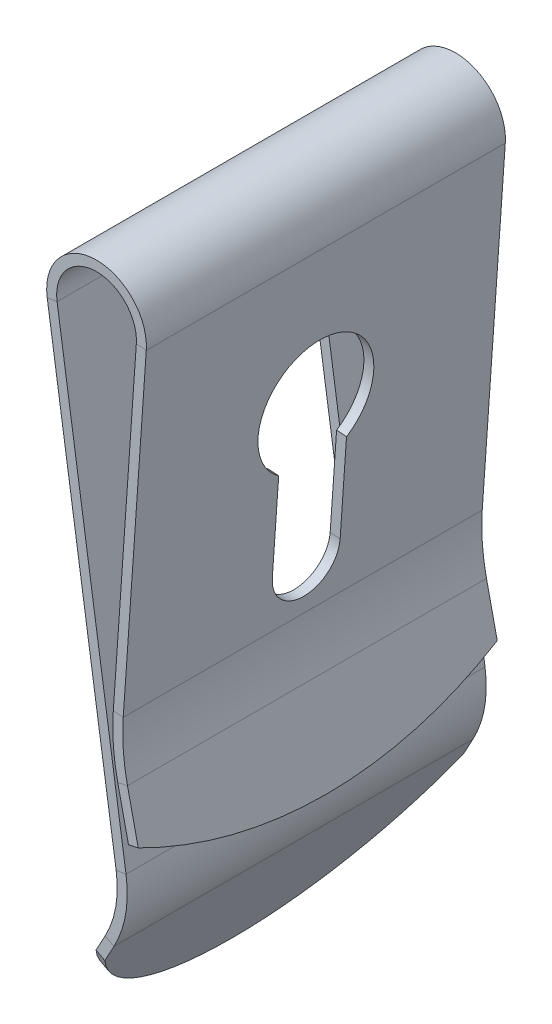
ISO-10303-21;
HEADER;
FILE_DESCRIPTION(('STEP AP214'),'2;1');
FILE_NAME('part.step','',(''),(''),'','','');
FILE_SCHEMA(('AUTOMOTIVE_DESIGN { 1 0 10303 214 1 1 1 1 }'));
ENDSEC;
DATA;
#1=APPLICATION_CONTEXT('core data for automotive mechanical design processes');
#2=APPLICATION_PROTOCOL_DEFINITION('international standard','automotive_design',2000,#1);
#3=PRODUCT_CONTEXT('',#1,'mechanical');
#4=PRODUCT('Part','Part','',(#3));
#5=PRODUCT_RELATED_PRODUCT_CATEGORY('part','',(#4));
#6=PRODUCT_DEFINITION_FORMATION('','',#4);
#7=PRODUCT_DEFINITION_CONTEXT('part definition',#1,'design');
#8=PRODUCT_DEFINITION('design','',#6,#7);
#9=PRODUCT_DEFINITION_SHAPE('','',#8);
#10=(LENGTH_UNIT() NAMED_UNIT(*) SI_UNIT(.MILLI.,.METRE.));
#11=(NAMED_UNIT(*) PLANE_ANGLE_UNIT() SI_UNIT($,.RADIAN.));
#12=(NAMED_UNIT(*) SI_UNIT($,.STERADIAN.) SOLID_ANGLE_UNIT());
#13=UNCERTAINTY_MEASURE_WITH_UNIT(LENGTH_MEASURE(1.E-05),#10,'distance_accuracy_value','');
#14=(GEOMETRIC_REPRESENTATION_CONTEXT(3) GLOBAL_UNCERTAINTY_ASSIGNED_CONTEXT((#13)) GLOBAL_UNIT_ASSIGNED_CONTEXT((#10,
#11,#12)) REPRESENTATION_CONTEXT('',''));
#15=CARTESIAN_POINT('',(0.,0.,0.));
#16=DIRECTION('',(0.,0.,1.));
#17=DIRECTION('',(1.,0.,0.));
#18=AXIS2_PLACEMENT_3D('',#15,#16,#17);
#19=CARTESIAN_POINT('',(-1.87719407398271,8.79440452735502,9.));
#20=DIRECTION('',(0.,0.,-1.));
#21=DIRECTION('',(0.147809411129617,-0.989015863361916,0.));
#22=AXIS2_PLACEMENT_3D('',#19,#20,#21);
#23=PLANE('',#22);
#24=DIRECTION('',(0.147809411129617,-0.989015863361916,0.));
#25=VECTOR('',#24,1.);
#26=CARTESIAN_POINT('',(-1.87719407398271,8.79440452735502,9.));
#27=LINE('',#26,#25);
#28=CARTESIAN_POINT('',(-3.21205123153018,17.7261423243411,9.));
#29=VERTEX_POINT('',#28);
#30=CARTESIAN_POINT('',(0.245047275760443,-5.40584391919345,9.));
#31=VERTEX_POINT('',#30);
#32=EDGE_CURVE('E333',#29,#31,#27,.T.);
#33=ORIENTED_EDGE('',*,*,#32,.T.);
#34=DIRECTION('',(0.989015863361916,0.147809411129617,0.));
#35=VECTOR('',#34,1.);
#36=CARTESIAN_POINT('',(0.245047275760442,-5.40584391919345,9.));
#37=LINE('',#36,#35);
#38=CARTESIAN_POINT('',(0.7395552074414,-5.33193921362864,9.));
#39=VERTEX_POINT('',#38);
#40=EDGE_CURVE('E299',#31,#39,#37,.T.);
#41=ORIENTED_EDGE('',*,*,#40,.T.);
#42=DIRECTION('',(0.147809411129617,-0.989015863361916,0.));
#43=VECTOR('',#42,1.);
#44=CARTESIAN_POINT('',(-1.38268614230175,8.86830923291983,9.));
#45=LINE('',#44,#43);
#46=CARTESIAN_POINT('',(-2.71754329984922,17.8000470299059,9.));
#47=VERTEX_POINT('',#46);
#48=EDGE_CURVE('E318',#47,#39,#45,.T.);
#49=ORIENTED_EDGE('',*,*,#48,.F.);
#50=DIRECTION('',(-0.989015863361916,-0.147809411129617,0.));
#51=VECTOR('',#50,1.);
#52=CARTESIAN_POINT('',(-3.21205123153018,17.7261423243411,9.));
#53=LINE('',#52,#51);
#54=EDGE_CURVE('E344',#47,#29,#53,.T.);
#55=ORIENTED_EDGE('',*,*,#54,.T.);
#56=EDGE_LOOP('',(#33,#41,#49,#55));
#57=FACE_BOUND('',#56,.T.);
#58=ADVANCED_FACE('F36',(#57),#23,.F.);
#59=CARTESIAN_POINT('',(-1.87719407398271,8.79440452735502,0.));
#60=DIRECTION('',(-0.989015863361916,-0.147809411129617,0.));
#61=DIRECTION('',(0.147809411129617,-0.989015863361916,0.));
#62=AXIS2_PLACEMENT_3D('',#59,#60,#61);
#63=PLANE('',#62);
#64=CARTESIAN_POINT('',(-2.16999488306638,10.7535804876395,0.));
#65=DIRECTION('',(-0.989015863361916,-0.147809411129617,0.));
#66=DIRECTION('',(-0.147809411129617,0.989015863361916,0.));
#67=AXIS2_PLACEMENT_3D('',#64,#65,#66);
#68=CIRCLE('',#67,3.55);
#69=CARTESIAN_POINT('',(-2.16999488306638,10.7535804876395,3.55));
#70=VERTEX_POINT('',#69);
#71=CARTESIAN_POINT('',(-2.16999488306638,10.7535804876395,-3.55));
#72=VERTEX_POINT('',#71);
#73=EDGE_CURVE('E245',#70,#72,#68,.T.);
#74=ORIENTED_EDGE('',*,*,#73,.F.);
#75=DIRECTION('',(-0.147809411129617,0.989015863361916,0.));
#76=VECTOR('',#75,1.);
#77=CARTESIAN_POINT('',(-2.16999488306638,10.7535804876395,3.55));
#78=LINE('',#77,#76);
#79=CARTESIAN_POINT('',(-1.16489088738498,4.02827261677847,3.55));
#80=VERTEX_POINT('',#79);
#81=EDGE_CURVE('E236',#80,#70,#78,.T.);
#82=ORIENTED_EDGE('',*,*,#81,.F.);
#83=CARTESIAN_POINT('',(-1.16489088738498,4.02827261677847,0.));
#84=DIRECTION('',(-0.989015863361916,-0.147809411129617,0.));
#85=DIRECTION('',(0.147809411129617,-0.989015863361916,0.));
#86=AXIS2_PLACEMENT_3D('',#83,#84,#85);
#87=CIRCLE('',#86,3.55);
#88=CARTESIAN_POINT('',(-1.16489088738498,4.02827261677847,-3.55));
#89=VERTEX_POINT('',#88);
#90=EDGE_CURVE('E239',#89,#80,#87,.T.);
#91=ORIENTED_EDGE('',*,*,#90,.F.);
#92=DIRECTION('',(0.147809411129617,-0.989015863361916,0.));
#93=VECTOR('',#92,1.);
#94=CARTESIAN_POINT('',(-2.16999488306638,10.7535804876395,-3.55));
#95=LINE('',#94,#93);
#96=EDGE_CURVE('E242',#72,#89,#95,.T.);
#97=ORIENTED_EDGE('',*,*,#96,.F.);
#98=EDGE_LOOP('',(#74,#82,#91,#97));
#99=FACE_BOUND('',#98,.T.);
#100=DIRECTION('',(-0.147809411129617,0.989015863361916,0.));
#101=VECTOR('',#100,1.);
#102=CARTESIAN_POINT('',(-1.87719407398271,8.79440452735502,-9.));
#103=LINE('',#102,#101);
#104=CARTESIAN_POINT('',(0.245047275760443,-5.40584391919345,-9.));
#105=VERTEX_POINT('',#104);
#106=CARTESIAN_POINT('',(-3.21205123153018,17.7261423243411,-9.));
#107=VERTEX_POINT('',#106);
#108=EDGE_CURVE('E327',#105,#107,#103,.T.);
#109=ORIENTED_EDGE('',*,*,#108,.F.);
#110=DIRECTION('',(0.,0.,1.));
#111=VECTOR('',#110,1.);
#112=CARTESIAN_POINT('',(0.245047275760442,-5.40584391919345,9.));
#113=LINE('',#112,#111);
#114=EDGE_CURVE('E305',#31,#105,#113,.F.);
#115=ORIENTED_EDGE('',*,*,#114,.F.);
#116=ORIENTED_EDGE('',*,*,#32,.F.);
#117=DIRECTION('',(0.,0.,1.));
#118=VECTOR('',#117,1.);
#119=CARTESIAN_POINT('',(-3.21205123153018,17.7261423243411,0.));
#120=LINE('',#119,#118);
#121=EDGE_CURVE('E330',#107,#29,#120,.T.);
#122=ORIENTED_EDGE('',*,*,#121,.F.);
#123=EDGE_LOOP('',(#109,#115,#116,#122));
#124=FACE_BOUND('',#123,.T.);
#125=ADVANCED_FACE('F447',(#99,#124),#63,.T.);
#126=CARTESIAN_POINT('',(-1.38268614230175,8.86830923291983,0.));
#127=DIRECTION('',(-0.989015863361916,-0.147809411129617,0.));
#128=DIRECTION('',(0.147809411129617,-0.989015863361916,0.));
#129=AXIS2_PLACEMENT_3D('',#126,#127,#128);
#130=PLANE('',#129);
#131=DIRECTION('',(0.147809411129617,-0.989015863361916,0.));
#132=VECTOR('',#131,1.);
#133=CARTESIAN_POINT('',(-1.67548695138542,10.8274851932043,3.55));
#134=LINE('',#133,#132);
#135=CARTESIAN_POINT('',(-1.67548695138542,10.8274851932043,3.55));
#136=VERTEX_POINT('',#135);
#137=CARTESIAN_POINT('',(-0.670382955704027,4.10217732234328,3.55));
#138=VERTEX_POINT('',#137);
#139=EDGE_CURVE('E250',#136,#138,#134,.T.);
#140=ORIENTED_EDGE('',*,*,#139,.F.);
#141=CARTESIAN_POINT('',(-1.67548695138542,10.8274851932043,0.));
#142=DIRECTION('',(-0.989015863361916,-0.147809411129617,0.));
#143=DIRECTION('',(0.147809411129617,-0.989015863361916,0.));
#144=AXIS2_PLACEMENT_3D('',#141,#142,#143);
#145=CIRCLE('',#144,3.55);
#146=CARTESIAN_POINT('',(-1.67548695138542,10.8274851932043,-3.55));
#147=VERTEX_POINT('',#146);
#148=EDGE_CURVE('E235',#147,#136,#145,.F.);
#149=ORIENTED_EDGE('',*,*,#148,.F.);
#150=DIRECTION('',(-0.147809411129617,0.989015863361916,0.));
#151=VECTOR('',#150,1.);
#152=CARTESIAN_POINT('',(-1.67548695138542,10.8274851932043,-3.55));
#153=LINE('',#152,#151);
#154=CARTESIAN_POINT('',(-0.670382955704026,4.10217732234328,-3.55));
#155=VERTEX_POINT('',#154);
#156=EDGE_CURVE('E232',#155,#147,#153,.T.);
#157=ORIENTED_EDGE('',*,*,#156,.F.);
#158=CARTESIAN_POINT('',(-0.670382955704027,4.10217732234328,0.));
#159=DIRECTION('',(-0.989015863361916,-0.147809411129617,0.));
#160=DIRECTION('',(0.147809411129617,-0.989015863361916,0.));
#161=AXIS2_PLACEMENT_3D('',#158,#159,#160);
#162=CIRCLE('',#161,3.55);
#163=EDGE_CURVE('E253',#138,#155,#162,.F.);
#164=ORIENTED_EDGE('',*,*,#163,.F.);
#165=EDGE_LOOP('',(#140,#149,#157,#164));
#166=FACE_BOUND('',#165,.T.);
#167=DIRECTION('',(0.,0.,1.));
#168=VECTOR('',#167,1.);
#169=CARTESIAN_POINT('',(0.7395552074414,-5.33193921362864,9.));
#170=LINE('',#169,#168);
#171=CARTESIAN_POINT('',(0.7395552074414,-5.33193921362864,-9.));
#172=VERTEX_POINT('',#171);
#173=EDGE_CURVE('E293',#39,#172,#170,.F.);
#174=ORIENTED_EDGE('',*,*,#173,.T.);
#175=DIRECTION('',(0.147809411129617,-0.989015863361916,0.));
#176=VECTOR('',#175,1.);
#177=CARTESIAN_POINT('',(-1.38268614230175,8.86830923291983,-9.));
#178=LINE('',#177,#176);
#179=CARTESIAN_POINT('',(-2.71754329984922,17.8000470299059,-9.));
#180=VERTEX_POINT('',#179);
#181=EDGE_CURVE('E336',#172,#180,#178,.F.);
#182=ORIENTED_EDGE('',*,*,#181,.T.);
#183=DIRECTION('',(0.,0.,1.));
#184=VECTOR('',#183,1.);
#185=CARTESIAN_POINT('',(-2.71754329984922,17.8000470299059,0.));
#186=LINE('',#185,#184);
#187=EDGE_CURVE('E338',#180,#47,#186,.T.);
#188=ORIENTED_EDGE('',*,*,#187,.T.);
#189=ORIENTED_EDGE('',*,*,#48,.T.);
#190=EDGE_LOOP('',(#174,#182,#188,#189));
#191=FACE_BOUND('',#190,.T.);
#192=ADVANCED_FACE('F431',(#166,#191),#130,.F.);
#193=CARTESIAN_POINT('',(0.498782025129912,-0.0348782368720627,9.));
#194=DIRECTION('',(-0.997564050259824,0.0697564737441255,0.));
#195=DIRECTION('',(-0.0697564737441255,-0.997564050259824,0.));
#196=AXIS2_PLACEMENT_3D('',#193,#194,#195);
#197=PLANE('',#196);
#198=DIRECTION('',(-0.0697564737441255,-0.997564050259824,0.));
#199=VECTOR('',#198,1.);
#200=CARTESIAN_POINT('',(1.09523698434969,8.49482507209064,1.70000000000001));
#201=LINE('',#200,#199);
#202=CARTESIAN_POINT('',(1.09523698434969,8.49482507209064,1.70000000000001));
#203=VERTEX_POINT('',#202);
#204=CARTESIAN_POINT('',(0.773427301904901,3.89273220526932,1.70000000000001));
#205=VERTEX_POINT('',#204);
#206=EDGE_CURVE('E216',#203,#205,#201,.T.);
#207=ORIENTED_EDGE('',*,*,#206,.F.);
#208=CARTESIAN_POINT('',(1.25912758894088,10.83856991096,0.));
#209=DIRECTION('',(0.997564050259824,-0.0697564737441255,0.));
#210=DIRECTION('',(-0.0697564737441255,-0.997564050259824,0.));
#211=AXIS2_PLACEMENT_3D('',#208,#209,#210);
#212=CIRCLE('',#211,2.9);
#213=CARTESIAN_POINT('',(1.09523698434969,8.49482507209064,-1.70000000000001));
#214=VERTEX_POINT('',#213);
#215=EDGE_CURVE('E51',#214,#203,#212,.T.);
#216=ORIENTED_EDGE('',*,*,#215,.F.);
#217=DIRECTION('',(0.0697564737441255,0.997564050259824,0.));
#218=VECTOR('',#217,1.);
#219=CARTESIAN_POINT('',(1.09523698434969,8.49482507209064,-1.70000000000001));
#220=LINE('',#219,#218);
#221=CARTESIAN_POINT('',(0.773427301904901,3.89273220526932,-1.70000000000001));
#222=VERTEX_POINT('',#221);
#223=EDGE_CURVE('E209',#222,#214,#220,.T.);
#224=ORIENTED_EDGE('',*,*,#223,.F.);
#225=CARTESIAN_POINT('',(0.773427301904901,3.89273220526932,0.));
#226=DIRECTION('',(0.997564050259824,-0.0697564737441255,0.));
#227=DIRECTION('',(0.0697564737441255,0.997564050259824,0.));
#228=AXIS2_PLACEMENT_3D('',#225,#226,#227);
#229=CIRCLE('',#228,1.70000000000001);
#230=EDGE_CURVE('E223',#205,#222,#229,.T.);
#231=ORIENTED_EDGE('',*,*,#230,.F.);
#232=EDGE_LOOP('',(#207,#216,#224,#231));
#233=FACE_BOUND('',#232,.T.);
#234=DIRECTION('',(0.,0.,-1.));
#235=VECTOR('',#234,1.);
#236=CARTESIAN_POINT('',(0.599924098507594,1.41152079901391,-8.99999999999999));
#237=LINE('',#236,#235);
#238=CARTESIAN_POINT('',(0.599924098507594,1.41152079901391,-9.));
#239=VERTEX_POINT('',#238);
#240=CARTESIAN_POINT('',(0.599924098507587,1.41152079901391,8.99999999999999));
#241=VERTEX_POINT('',#240);
#242=EDGE_CURVE('E391',#239,#241,#237,.F.);
#243=ORIENTED_EDGE('',*,*,#242,.F.);
#244=DIRECTION('',(0.0697564737441255,0.997564050259824,0.));
#245=VECTOR('',#244,1.);
#246=CARTESIAN_POINT('',(0.498782025129912,-0.0348782368720627,-9.));
#247=LINE('',#246,#245);
#248=CARTESIAN_POINT('',(1.7543985525241,17.9212746678048,-9.));
#249=VERTEX_POINT('',#248);
#250=EDGE_CURVE('E398',#239,#249,#247,.T.);
#251=ORIENTED_EDGE('',*,*,#250,.T.);
#252=DIRECTION('',(0.,0.,-1.));
#253=VECTOR('',#252,1.);
#254=CARTESIAN_POINT('',(1.75439855252417,17.9212746678048,9.));
#255=LINE('',#254,#253);
#256=CARTESIAN_POINT('',(1.75439855252417,17.9212746678048,9.));
#257=VERTEX_POINT('',#256);
#258=EDGE_CURVE('E11',#257,#249,#255,.T.);
#259=ORIENTED_EDGE('',*,*,#258,.F.);
#260=DIRECTION('',(0.0697564737441255,0.997564050259824,0.));
#261=VECTOR('',#260,1.);
#262=CARTESIAN_POINT('',(0.498782025129912,-0.0348782368720627,9.));
#263=LINE('',#262,#261);
#264=EDGE_CURVE('E401',#241,#257,#263,.T.);
#265=ORIENTED_EDGE('',*,*,#264,.F.);
#266=EDGE_LOOP('',(#243,#251,#259,#265));
#267=FACE_BOUND('',#266,.T.);
#268=ADVANCED_FACE('F38',(#233,#267),#197,.F.);
#269=CARTESIAN_POINT('',(0.,0.,9.));
#270=DIRECTION('',(-0.997564050259824,0.0697564737441255,0.));
#271=DIRECTION('',(-0.0697564737441255,-0.997564050259824,0.));
#272=AXIS2_PLACEMENT_3D('',#269,#270,#271);
#273=PLANE('',#272);
#274=CARTESIAN_POINT('',(0.760345563810965,10.8734481478321,0.));
#275=DIRECTION('',(-0.997564050259824,0.0697564737441255,0.));
#276=DIRECTION('',(-0.0697564737441255,-0.997564050259824,0.));
#277=AXIS2_PLACEMENT_3D('',#274,#275,#276);
#278=CIRCLE('',#277,2.9);
#279=CARTESIAN_POINT('',(0.596454959219774,8.5297033089627,-1.70000000000001));
#280=VERTEX_POINT('',#279);
#281=CARTESIAN_POINT('',(0.596454959219774,8.5297033089627,1.70000000000001));
#282=VERTEX_POINT('',#281);
#283=EDGE_CURVE('E207',#280,#282,#278,.F.);
#284=ORIENTED_EDGE('',*,*,#283,.T.);
#285=DIRECTION('',(-0.0697564737441255,-0.997564050259824,0.));
#286=VECTOR('',#285,1.);
#287=CARTESIAN_POINT('',(0.596454959219775,8.5297033089627,1.70000000000001));
#288=LINE('',#287,#286);
#289=CARTESIAN_POINT('',(0.274645276774988,3.92761044214137,1.70000000000001));
#290=VERTEX_POINT('',#289);
#291=EDGE_CURVE('E196',#282,#290,#288,.T.);
#292=ORIENTED_EDGE('',*,*,#291,.T.);
#293=CARTESIAN_POINT('',(0.274645276774988,3.92761044214138,0.));
#294=DIRECTION('',(-0.997564050259824,0.0697564737441255,0.));
#295=DIRECTION('',(-0.0697564737441255,-0.997564050259824,0.));
#296=AXIS2_PLACEMENT_3D('',#293,#294,#295);
#297=CIRCLE('',#296,1.70000000000001);
#298=CARTESIAN_POINT('',(0.274645276774988,3.92761044214138,-1.70000000000001));
#299=VERTEX_POINT('',#298);
#300=EDGE_CURVE('E218',#290,#299,#297,.F.);
#301=ORIENTED_EDGE('',*,*,#300,.T.);
#302=DIRECTION('',(0.0697564737441255,0.997564050259824,0.));
#303=VECTOR('',#302,1.);
#304=CARTESIAN_POINT('',(0.596454959219775,8.5297033089627,-1.70000000000001));
#305=LINE('',#304,#303);
#306=EDGE_CURVE('E214',#299,#280,#305,.T.);
#307=ORIENTED_EDGE('',*,*,#306,.T.);
#308=EDGE_LOOP('',(#284,#292,#301,#307));
#309=FACE_BOUND('',#308,.T.);
#310=DIRECTION('',(0.0697564737441255,0.997564050259824,0.));
#311=VECTOR('',#310,1.);
#312=CARTESIAN_POINT('',(0.,0.,-9.));
#313=LINE('',#312,#311);
#314=CARTESIAN_POINT('',(0.101142073377683,1.44639903588598,-9.));
#315=VERTEX_POINT('',#314);
#316=CARTESIAN_POINT('',(1.25561652739426,17.9561529046768,-9.));
#317=VERTEX_POINT('',#316);
#318=EDGE_CURVE('E404',#315,#317,#313,.T.);
#319=ORIENTED_EDGE('',*,*,#318,.F.);
#320=DIRECTION('',(0.,0.,-1.));
#321=VECTOR('',#320,1.);
#322=CARTESIAN_POINT('',(0.101142073377683,1.44639903588598,-9.));
#323=LINE('',#322,#321);
#324=CARTESIAN_POINT('',(0.101142073377674,1.44639903588598,8.99999999999999));
#325=VERTEX_POINT('',#324);
#326=EDGE_CURVE('E378',#315,#325,#323,.F.);
#327=ORIENTED_EDGE('',*,*,#326,.T.);
#328=DIRECTION('',(0.0697564737441255,0.997564050259824,0.));
#329=VECTOR('',#328,1.);
#330=CARTESIAN_POINT('',(0.,0.,9.));
#331=LINE('',#330,#329);
#332=CARTESIAN_POINT('',(1.25561652739426,17.9561529046768,9.));
#333=VERTEX_POINT('',#332);
#334=EDGE_CURVE('E407',#325,#333,#331,.T.);
#335=ORIENTED_EDGE('',*,*,#334,.T.);
#336=DIRECTION('',(0.,0.,-1.));
#337=VECTOR('',#336,1.);
#338=CARTESIAN_POINT('',(1.25561652739426,17.9561529046768,9.));
#339=LINE('',#338,#337);
#340=EDGE_CURVE('E44',#333,#317,#339,.T.);
#341=ORIENTED_EDGE('',*,*,#340,.T.);
#342=EDGE_LOOP('',(#319,#327,#335,#341));
#343=FACE_BOUND('',#342,.T.);
#344=ADVANCED_FACE('F212',(#309,#343),#273,.T.);
#345=CARTESIAN_POINT('',(1.75439855252417,17.9212746678048,9.));
#346=DIRECTION('',(0.,0.,-1.));
#347=DIRECTION('',(-1.,0.,0.));
#348=AXIS2_PLACEMENT_3D('',#345,#346,#347);
#349=PLANE('',#348);
#350=DIRECTION('',(-0.997564050259824,0.0697564737441254,0.));
#351=VECTOR('',#350,1.);
#352=CARTESIAN_POINT('',(0.599924098507587,1.41152079901391,8.99999999999999));
#353=LINE('',#352,#351);
#354=EDGE_CURVE('E395',#241,#325,#353,.T.);
#355=ORIENTED_EDGE('',*,*,#354,.F.);
#356=ORIENTED_EDGE('',*,*,#264,.T.);
#357=DIRECTION('',(0.997564050259825,-0.0697564737441175,0.));
#358=VECTOR('',#357,1.);
#359=CARTESIAN_POINT('',(1.25561652739426,17.9561529046768,9.));
#360=LINE('',#359,#358);
#361=EDGE_CURVE('E403',#333,#257,#360,.T.);
#362=ORIENTED_EDGE('',*,*,#361,.F.);
#363=ORIENTED_EDGE('',*,*,#334,.F.);
#364=EDGE_LOOP('',(#355,#356,#362,#363));
#365=FACE_BOUND('',#364,.T.);
#366=ADVANCED_FACE('F536',(#365),#349,.F.);
#367=CARTESIAN_POINT('',(1.75439855252417,17.9212746678048,-9.));
#368=DIRECTION('',(0.,0.,-1.));
#369=DIRECTION('',(-1.,0.,0.));
#370=AXIS2_PLACEMENT_3D('',#367,#368,#369);
#371=PLANE('',#370);
#372=ORIENTED_EDGE('',*,*,#250,.F.);
#373=DIRECTION('',(-0.997564050259824,0.0697564737441254,0.));
#374=VECTOR('',#373,1.);
#375=CARTESIAN_POINT('',(0.599924098507594,1.41152079901391,-9.));
#376=LINE('',#375,#374);
#377=EDGE_CURVE('E385',#239,#315,#376,.T.);
#378=ORIENTED_EDGE('',*,*,#377,.T.);
#379=ORIENTED_EDGE('',*,*,#318,.T.);
#380=DIRECTION('',(0.997564050259825,-0.0697564737441175,0.));
#381=VECTOR('',#380,1.);
#382=CARTESIAN_POINT('',(1.25561652739426,17.9561529046768,-9.));
#383=LINE('',#382,#381);
#384=EDGE_CURVE('E411',#317,#249,#383,.T.);
#385=ORIENTED_EDGE('',*,*,#384,.T.);
#386=EDGE_LOOP('',(#372,#378,#379,#385));
#387=FACE_BOUND('',#386,.T.);
#388=ADVANCED_FACE('F531',(#387),#371,.T.);
#389=CARTESIAN_POINT('',(10.5755646011058,0.713956061572662,8.99999999999999));
#390=DIRECTION('',(0.,0.,1.));
#391=DIRECTION('',(1.,0.,0.));
#392=AXIS2_PLACEMENT_3D('',#389,#390,#391);
#393=PLANE('',#392);
#394=DIRECTION('',(-0.976296007119935,-0.216439613938097,0.));
#395=VECTOR('',#394,1.);
#396=CARTESIAN_POINT('',(0.812604529906481,-1.4504400778083,9.));
#397=LINE('',#396,#395);
#398=CARTESIAN_POINT('',(0.812604529906483,-1.4504400778083,8.99999999999999));
#399=VERTEX_POINT('',#398);
#400=CARTESIAN_POINT('',(0.324456526346514,-1.55865988477735,8.99999999999998));
#401=VERTEX_POINT('',#400);
#402=EDGE_CURVE('E347',#399,#401,#397,.T.);
#403=ORIENTED_EDGE('',*,*,#402,.F.);
#404=CARTESIAN_POINT('',(10.5755646011058,0.713956061572662,8.99999999999999));
#405=DIRECTION('',(0.,0.,-1.));
#406=DIRECTION('',(-1.,0.,0.));
#407=AXIS2_PLACEMENT_3D('',#404,#405,#406);
#408=CIRCLE('',#407,9.99999999999999);
#409=EDGE_CURVE('E388',#241,#399,#408,.F.);
#410=ORIENTED_EDGE('',*,*,#409,.F.);
#411=ORIENTED_EDGE('',*,*,#354,.T.);
#412=CARTESIAN_POINT('',(10.5755646011058,0.713956061572662,8.99999999999998));
#413=DIRECTION('',(0.,0.,-1.));
#414=DIRECTION('',(-1.,0.,0.));
#415=AXIS2_PLACEMENT_3D('',#412,#413,#414);
#416=CIRCLE('',#415,10.5);
#417=EDGE_CURVE('E381',#325,#401,#416,.F.);
#418=ORIENTED_EDGE('',*,*,#417,.T.);
#419=EDGE_LOOP('',(#403,#410,#411,#418));
#420=FACE_BOUND('',#419,.T.);
#421=ADVANCED_FACE('F525',(#420),#393,.T.);
#422=CARTESIAN_POINT('',(10.5755646011058,0.713956061572662,-8.99999999999999));
#423=DIRECTION('',(0.,0.,1.));
#424=DIRECTION('',(1.,0.,0.));
#425=AXIS2_PLACEMENT_3D('',#422,#423,#424);
#426=PLANE('',#425);
#427=CARTESIAN_POINT('',(10.5755646011058,0.713956061572662,-8.99999999999999));
#428=DIRECTION('',(0.,0.,-1.));
#429=DIRECTION('',(-1.,0.,0.));
#430=AXIS2_PLACEMENT_3D('',#427,#428,#429);
#431=CIRCLE('',#430,9.99999999999999);
#432=CARTESIAN_POINT('',(0.81260452990649,-1.4504400778083,-9.));
#433=VERTEX_POINT('',#432);
#434=EDGE_CURVE('E377',#433,#239,#431,.T.);
#435=ORIENTED_EDGE('',*,*,#434,.F.);
#436=DIRECTION('',(-0.976296007119935,-0.216439613938097,0.));
#437=VECTOR('',#436,1.);
#438=CARTESIAN_POINT('',(0.812604529906482,-1.4504400778083,-9.));
#439=LINE('',#438,#437);
#440=CARTESIAN_POINT('',(0.324456526346514,-1.55865988477735,-9.));
#441=VERTEX_POINT('',#440);
#442=EDGE_CURVE('E350',#433,#441,#439,.T.);
#443=ORIENTED_EDGE('',*,*,#442,.T.);
#444=CARTESIAN_POINT('',(10.5755646011058,0.713956061572662,-8.99999999999999));
#445=DIRECTION('',(0.,0.,-1.));
#446=DIRECTION('',(-1.,0.,0.));
#447=AXIS2_PLACEMENT_3D('',#444,#445,#446);
#448=CIRCLE('',#447,10.5);
#449=EDGE_CURVE('E382',#441,#315,#448,.T.);
#450=ORIENTED_EDGE('',*,*,#449,.T.);
#451=ORIENTED_EDGE('',*,*,#377,.F.);
#452=EDGE_LOOP('',(#435,#443,#450,#451));
#453=FACE_BOUND('',#452,.T.);
#454=ADVANCED_FACE('F523',(#453),#426,.F.);
#455=CARTESIAN_POINT('',(10.5755646011058,0.713956061572662,-8.99999999999999));
#456=DIRECTION('',(0.,0.,-1.));
#457=DIRECTION('',(-0.976296007119935,-0.216439613938097,0.));
#458=AXIS2_PLACEMENT_3D('',#455,#456,#457);
#459=CYLINDRICAL_SURFACE('',#458,10.5);
#460=ORIENTED_EDGE('',*,*,#326,.F.);
#461=ORIENTED_EDGE('',*,*,#449,.F.);
#462=DIRECTION('',(0.,0.,1.));
#463=VECTOR('',#462,1.);
#464=CARTESIAN_POINT('',(0.324456526346514,-1.55865988477735,0.));
#465=LINE('',#464,#463);
#466=EDGE_CURVE('E353',#441,#401,#465,.T.);
#467=ORIENTED_EDGE('',*,*,#466,.T.);
#468=ORIENTED_EDGE('',*,*,#417,.F.);
#469=EDGE_LOOP('',(#460,#461,#467,#468));
#470=FACE_BOUND('',#469,.T.);
#471=ADVANCED_FACE('F520',(#470),#459,.T.);
#472=CARTESIAN_POINT('',(10.5755646011058,0.713956061572662,-8.99999999999999));
#473=DIRECTION('',(0.,0.,-1.));
#474=DIRECTION('',(-0.976296007119935,-0.216439613938097,0.));
#475=AXIS2_PLACEMENT_3D('',#472,#473,#474);
#476=CYLINDRICAL_SURFACE('',#475,9.99999999999999);
#477=ORIENTED_EDGE('',*,*,#242,.T.);
#478=ORIENTED_EDGE('',*,*,#409,.T.);
#479=DIRECTION('',(0.,0.,-1.));
#480=VECTOR('',#479,1.);
#481=CARTESIAN_POINT('',(0.812604529906481,-1.4504400778083,9.));
#482=LINE('',#481,#480);
#483=EDGE_CURVE('E348',#399,#433,#482,.T.);
#484=ORIENTED_EDGE('',*,*,#483,.T.);
#485=ORIENTED_EDGE('',*,*,#434,.T.);
#486=EDGE_LOOP('',(#477,#478,#484,#485));
#487=FACE_BOUND('',#486,.T.);
#488=ADVANCED_FACE('F518',(#487),#476,.F.);
#489=CARTESIAN_POINT('',(0.0106340215699448,-0.143098043841111,9.));
#490=DIRECTION('',(0.,0.,-1.));
#491=DIRECTION('',(-1.,0.,0.));
#492=AXIS2_PLACEMENT_3D('',#489,#490,#491);
#493=PLANE('',#492);
#494=ORIENTED_EDGE('',*,*,#402,.T.);
#495=DIRECTION('',(-0.216439613938097,0.976296007119935,0.));
#496=VECTOR('',#495,1.);
#497=CARTESIAN_POINT('',(0.0106340215699448,-0.143098043841111,9.));
#498=LINE('',#497,#496);
#499=CARTESIAN_POINT('',(0.863583819091926,-3.99050594872046,8.99999999999999));
#500=VERTEX_POINT('',#499);
#501=EDGE_CURVE('E358',#500,#401,#498,.T.);
#502=ORIENTED_EDGE('',*,*,#501,.F.);
#503=DIRECTION('',(0.976296007119935,0.216439613938097,0.));
#504=VECTOR('',#503,1.);
#505=CARTESIAN_POINT('',(0.863583819091926,-3.99050594872046,8.99999999999999));
#506=LINE('',#505,#504);
#507=CARTESIAN_POINT('',(1.35173182265189,-3.88228614175141,8.99999999999999));
#508=VERTEX_POINT('',#507);
#509=EDGE_CURVE('E366',#500,#508,#506,.T.);
#510=ORIENTED_EDGE('',*,*,#509,.T.);
#511=DIRECTION('',(-0.216439613938097,0.976296007119935,0.));
#512=VECTOR('',#511,1.);
#513=CARTESIAN_POINT('',(0.498782025129912,-0.0348782368720627,9.));
#514=LINE('',#513,#512);
#515=EDGE_CURVE('E357',#508,#399,#514,.T.);
#516=ORIENTED_EDGE('',*,*,#515,.T.);
#517=EDGE_LOOP('',(#494,#502,#510,#516));
#518=FACE_BOUND('',#517,.T.);
#519=ADVANCED_FACE('F514',(#518),#493,.F.);
#520=CARTESIAN_POINT('',(0.863583819091926,-3.99050594872046,-9.));
#521=DIRECTION('',(0.,0.,1.));
#522=DIRECTION('',(0.,-1.,0.));
#523=AXIS2_PLACEMENT_3D('',#520,#521,#522);
#524=PLANE('',#523);
#525=ORIENTED_EDGE('',*,*,#442,.F.);
#526=DIRECTION('',(0.216439613938097,-0.976296007119935,0.));
#527=VECTOR('',#526,1.);
#528=CARTESIAN_POINT('',(1.35173182265189,-3.88228614175141,-9.));
#529=LINE('',#528,#527);
#530=CARTESIAN_POINT('',(1.35173182265189,-3.88228614175141,-9.));
#531=VERTEX_POINT('',#530);
#532=EDGE_CURVE('E369',#433,#531,#529,.T.);
#533=ORIENTED_EDGE('',*,*,#532,.T.);
#534=DIRECTION('',(0.976296007119935,0.216439613938097,0.));
#535=VECTOR('',#534,1.);
#536=CARTESIAN_POINT('',(0.863583819091926,-3.99050594872046,-9.));
#537=LINE('',#536,#535);
#538=CARTESIAN_POINT('',(0.863583819091926,-3.99050594872046,-9.));
#539=VERTEX_POINT('',#538);
#540=EDGE_CURVE('E374',#539,#531,#537,.T.);
#541=ORIENTED_EDGE('',*,*,#540,.F.);
#542=DIRECTION('',(0.216439613938097,-0.976296007119935,0.));
#543=VECTOR('',#542,1.);
#544=CARTESIAN_POINT('',(0.863583819091926,-3.99050594872046,-9.));
#545=LINE('',#544,#543);
#546=EDGE_CURVE('E361',#441,#539,#545,.T.);
#547=ORIENTED_EDGE('',*,*,#546,.F.);
#548=EDGE_LOOP('',(#525,#533,#541,#547));
#549=FACE_BOUND('',#548,.T.);
#550=ADVANCED_FACE('F503',(#549),#524,.F.);
#551=CARTESIAN_POINT('',(-3.30287874921643,14.8031921883383,0.));
#552=DIRECTION('',(0.976296007119935,0.216439613938097,0.));
#553=DIRECTION('',(-0.216439613938097,0.976296007119935,0.));
#554=AXIS2_PLACEMENT_3D('',#551,#552,#553);
#555=PLANE('',#554);
#556=ORIENTED_EDGE('',*,*,#466,.F.);
#557=ORIENTED_EDGE('',*,*,#546,.T.);
#558=CARTESIAN_POINT('',(-3.30287874921643,14.8031921883383,0.));
#559=DIRECTION('',(-0.976296007119935,-0.216439613938097,0.));
#560=DIRECTION('',(-0.216439613938097,0.976296007119935,0.));
#561=AXIS2_PLACEMENT_3D('',#558,#559,#560);
#562=CIRCLE('',#561,21.25);
#563=EDGE_CURVE('E364',#539,#500,#562,.T.);
#564=ORIENTED_EDGE('',*,*,#563,.T.);
#565=ORIENTED_EDGE('',*,*,#501,.T.);
#566=EDGE_LOOP('',(#556,#557,#564,#565));
#567=FACE_BOUND('',#566,.T.);
#568=ADVANCED_FACE('F499',(#567),#555,.F.);
#569=CARTESIAN_POINT('',(-2.81473074565646,14.9114119953073,0.));
#570=DIRECTION('',(0.976296007119935,0.216439613938097,0.));
#571=DIRECTION('',(-0.216439613938097,0.976296007119935,0.));
#572=AXIS2_PLACEMENT_3D('',#569,#570,#571);
#573=PLANE('',#572);
#574=ORIENTED_EDGE('',*,*,#532,.F.);
#575=ORIENTED_EDGE('',*,*,#483,.F.);
#576=ORIENTED_EDGE('',*,*,#515,.F.);
#577=CARTESIAN_POINT('',(-2.81473074565646,14.9114119953073,0.));
#578=DIRECTION('',(-0.976296007119935,-0.216439613938097,0.));
#579=DIRECTION('',(-0.216439613938097,0.976296007119935,0.));
#580=AXIS2_PLACEMENT_3D('',#577,#578,#579);
#581=CIRCLE('',#580,21.25);
#582=EDGE_CURVE('E362',#531,#508,#581,.T.);
#583=ORIENTED_EDGE('',*,*,#582,.F.);
#584=EDGE_LOOP('',(#574,#575,#576,#583));
#585=FACE_BOUND('',#584,.T.);
#586=ADVANCED_FACE('F502',(#585),#573,.T.);
#587=CARTESIAN_POINT('',(-3.30287874921643,14.8031921883383,0.));
#588=DIRECTION('',(0.976296007119935,0.216439613938097,0.));
#589=DIRECTION('',(-0.216439613938097,0.976296007119935,0.));
#590=AXIS2_PLACEMENT_3D('',#587,#588,#589);
#591=CYLINDRICAL_SURFACE('',#590,21.25);
#592=ORIENTED_EDGE('',*,*,#582,.T.);
#593=ORIENTED_EDGE('',*,*,#509,.F.);
#594=ORIENTED_EDGE('',*,*,#563,.F.);
#595=ORIENTED_EDGE('',*,*,#540,.T.);
#596=EDGE_LOOP('',(#592,#593,#594,#595));
#597=FACE_BOUND('',#596,.T.);
#598=ADVANCED_FACE('F507',(#597),#591,.T.);
#599=CARTESIAN_POINT('',(-1.87719407398271,8.79440452735502,-9.));
#600=DIRECTION('',(0.,0.,1.));
#601=DIRECTION('',(-0.147809411129617,0.989015863361916,0.));
#602=AXIS2_PLACEMENT_3D('',#599,#600,#601);
#603=PLANE('',#602);
#604=DIRECTION('',(0.989015863361916,0.147809411129617,0.));
#605=VECTOR('',#604,1.);
#606=CARTESIAN_POINT('',(0.245047275760442,-5.40584391919345,-9.));
#607=LINE('',#606,#605);
#608=EDGE_CURVE('E310',#105,#172,#607,.T.);
#609=ORIENTED_EDGE('',*,*,#608,.F.);
#610=ORIENTED_EDGE('',*,*,#108,.T.);
#611=DIRECTION('',(-0.989015863361916,-0.147809411129617,0.));
#612=VECTOR('',#611,1.);
#613=CARTESIAN_POINT('',(-3.21205123153018,17.7261423243411,-9.));
#614=LINE('',#613,#612);
#615=EDGE_CURVE('E329',#180,#107,#614,.T.);
#616=ORIENTED_EDGE('',*,*,#615,.F.);
#617=ORIENTED_EDGE('',*,*,#181,.F.);
#618=EDGE_LOOP('',(#609,#610,#616,#617));
#619=FACE_BOUND('',#618,.T.);
#620=ADVANCED_FACE('F449',(#619),#603,.F.);
#621=CARTESIAN_POINT('',(-0.739511573125427,18.0956658521651,9.));
#622=DIRECTION('',(0.,0.,1.));
#623=DIRECTION('',(1.,0.,0.));
#624=AXIS2_PLACEMENT_3D('',#621,#622,#623);
#625=PLANE('',#624);
#626=ORIENTED_EDGE('',*,*,#54,.F.);
#627=CARTESIAN_POINT('',(-0.739511573125427,18.0956658521651,9.));
#628=DIRECTION('',(0.,0.,-1.));
#629=DIRECTION('',(-1.,0.,0.));
#630=AXIS2_PLACEMENT_3D('',#627,#628,#629);
#631=CIRCLE('',#630,1.99999999999996);
#632=EDGE_CURVE('E322',#333,#47,#631,.F.);
#633=ORIENTED_EDGE('',*,*,#632,.F.);
#634=ORIENTED_EDGE('',*,*,#361,.T.);
#635=CARTESIAN_POINT('',(-0.739511573125427,18.0956658521651,9.));
#636=DIRECTION('',(0.,0.,-1.));
#637=DIRECTION('',(-1.,0.,0.));
#638=AXIS2_PLACEMENT_3D('',#635,#636,#637);
#639=CIRCLE('',#638,2.49999999999996);
#640=EDGE_CURVE('E315',#257,#29,#639,.F.);
#641=ORIENTED_EDGE('',*,*,#640,.T.);
#642=EDGE_LOOP('',(#626,#633,#634,#641));
#643=FACE_BOUND('',#642,.T.);
#644=ADVANCED_FACE('F439',(#643),#625,.T.);
#645=CARTESIAN_POINT('',(-0.739511573125425,18.0956658521651,-9.));
#646=DIRECTION('',(0.,0.,1.));
#647=DIRECTION('',(1.,0.,0.));
#648=AXIS2_PLACEMENT_3D('',#645,#646,#647);
#649=PLANE('',#648);
#650=CARTESIAN_POINT('',(-0.739511573125425,18.0956658521651,-9.));
#651=DIRECTION('',(0.,0.,-1.));
#652=DIRECTION('',(-1.,0.,0.));
#653=AXIS2_PLACEMENT_3D('',#650,#651,#652);
#654=CIRCLE('',#653,1.99999999999996);
#655=EDGE_CURVE('E313',#180,#317,#654,.T.);
#656=ORIENTED_EDGE('',*,*,#655,.F.);
#657=ORIENTED_EDGE('',*,*,#615,.T.);
#658=CARTESIAN_POINT('',(-0.739511573125425,18.0956658521651,-9.));
#659=DIRECTION('',(0.,0.,-1.));
#660=DIRECTION('',(-1.,0.,0.));
#661=AXIS2_PLACEMENT_3D('',#658,#659,#660);
#662=CIRCLE('',#661,2.49999999999996);
#663=EDGE_CURVE('E319',#107,#249,#662,.T.);
#664=ORIENTED_EDGE('',*,*,#663,.T.);
#665=ORIENTED_EDGE('',*,*,#384,.F.);
#666=EDGE_LOOP('',(#656,#657,#664,#665));
#667=FACE_BOUND('',#666,.T.);
#668=ADVANCED_FACE('F423',(#667),#649,.F.);
#669=CARTESIAN_POINT('',(-0.739511573125425,18.0956658521651,-9.));
#670=DIRECTION('',(0.,0.,-1.));
#671=DIRECTION('',(-0.989015863361916,-0.147809411129617,0.));
#672=AXIS2_PLACEMENT_3D('',#669,#670,#671);
#673=CYLINDRICAL_SURFACE('',#672,2.49999999999996);
#674=ORIENTED_EDGE('',*,*,#258,.T.);
#675=ORIENTED_EDGE('',*,*,#663,.F.);
#676=ORIENTED_EDGE('',*,*,#121,.T.);
#677=ORIENTED_EDGE('',*,*,#640,.F.);
#678=EDGE_LOOP('',(#674,#675,#676,#677));
#679=FACE_BOUND('',#678,.T.);
#680=ADVANCED_FACE('F442',(#679),#673,.T.);
#681=CARTESIAN_POINT('',(-0.739511573125425,18.0956658521651,-9.));
#682=DIRECTION('',(0.,0.,-1.));
#683=DIRECTION('',(-0.989015863361916,-0.147809411129617,0.));
#684=AXIS2_PLACEMENT_3D('',#681,#682,#683);
#685=CYLINDRICAL_SURFACE('',#684,1.99999999999996);
#686=ORIENTED_EDGE('',*,*,#340,.F.);
#687=ORIENTED_EDGE('',*,*,#632,.T.);
#688=ORIENTED_EDGE('',*,*,#187,.F.);
#689=ORIENTED_EDGE('',*,*,#655,.T.);
#690=EDGE_LOOP('',(#686,#687,#688,#689));
#691=FACE_BOUND('',#690,.T.);
#692=ADVANCED_FACE('F428',(#691),#685,.F.);
#693=CARTESIAN_POINT('',(-4.70003204104914,-6.14489097484153,-9.));
#694=DIRECTION('',(0.,0.,-1.));
#695=DIRECTION('',(-1.,0.,0.));
#696=AXIS2_PLACEMENT_3D('',#693,#694,#695);
#697=PLANE('',#696);
#698=DIRECTION('',(0.878817112661971,-0.477158760259599,0.));
#699=VECTOR('',#698,1.);
#700=CARTESIAN_POINT('',(-0.305946477739285,-8.53068477613953,-9.));
#701=LINE('',#700,#699);
#702=CARTESIAN_POINT('',(-0.305946477739284,-8.53068477613953,-9.));
#703=VERTEX_POINT('',#702);
#704=CARTESIAN_POINT('',(0.133462078591701,-8.76926415626932,-9.));
#705=VERTEX_POINT('',#704);
#706=EDGE_CURVE('E255',#703,#705,#701,.T.);
#707=ORIENTED_EDGE('',*,*,#706,.F.);
#708=CARTESIAN_POINT('',(-4.70003204104914,-6.14489097484153,-9.));
#709=DIRECTION('',(0.,0.,1.));
#710=DIRECTION('',(1.,0.,0.));
#711=AXIS2_PLACEMENT_3D('',#708,#709,#710);
#712=CIRCLE('',#711,5.);
#713=EDGE_CURVE('E302',#105,#703,#712,.F.);
#714=ORIENTED_EDGE('',*,*,#713,.F.);
#715=ORIENTED_EDGE('',*,*,#608,.T.);
#716=CARTESIAN_POINT('',(-4.70003204104914,-6.14489097484153,-9.));
#717=DIRECTION('',(0.,0.,1.));
#718=DIRECTION('',(1.,0.,0.));
#719=AXIS2_PLACEMENT_3D('',#716,#717,#718);
#720=CIRCLE('',#719,5.5);
#721=EDGE_CURVE('E295',#172,#705,#720,.F.);
#722=ORIENTED_EDGE('',*,*,#721,.T.);
#723=EDGE_LOOP('',(#707,#714,#715,#722));
#724=FACE_BOUND('',#723,.T.);
#725=ADVANCED_FACE('F453',(#724),#697,.T.);
#726=CARTESIAN_POINT('',(-4.70003204104914,-6.14489097484153,9.));
#727=DIRECTION('',(0.,0.,-1.));
#728=DIRECTION('',(-1.,0.,0.));
#729=AXIS2_PLACEMENT_3D('',#726,#727,#728);
#730=PLANE('',#729);
#731=CARTESIAN_POINT('',(-4.70003204104914,-6.14489097484153,9.));
#732=DIRECTION('',(0.,0.,1.));
#733=DIRECTION('',(1.,0.,0.));
#734=AXIS2_PLACEMENT_3D('',#731,#732,#733);
#735=CIRCLE('',#734,5.);
#736=CARTESIAN_POINT('',(-0.305946477739284,-8.53068477613953,9.));
#737=VERTEX_POINT('',#736);
#738=EDGE_CURVE('E292',#737,#31,#735,.T.);
#739=ORIENTED_EDGE('',*,*,#738,.F.);
#740=DIRECTION('',(0.878817112661971,-0.477158760259599,0.));
#741=VECTOR('',#740,1.);
#742=CARTESIAN_POINT('',(-0.305946477739284,-8.53068477613953,9.));
#743=LINE('',#742,#741);
#744=CARTESIAN_POINT('',(0.133462078591701,-8.76926415626932,9.));
#745=VERTEX_POINT('',#744);
#746=EDGE_CURVE('E265',#737,#745,#743,.T.);
#747=ORIENTED_EDGE('',*,*,#746,.T.);
#748=CARTESIAN_POINT('',(-4.70003204104914,-6.14489097484153,9.));
#749=DIRECTION('',(0.,0.,1.));
#750=DIRECTION('',(1.,0.,0.));
#751=AXIS2_PLACEMENT_3D('',#748,#749,#750);
#752=CIRCLE('',#751,5.5);
#753=EDGE_CURVE('E296',#745,#39,#752,.T.);
#754=ORIENTED_EDGE('',*,*,#753,.T.);
#755=ORIENTED_EDGE('',*,*,#40,.F.);
#756=EDGE_LOOP('',(#739,#747,#754,#755));
#757=FACE_BOUND('',#756,.T.);
#758=ADVANCED_FACE('F713',(#757),#730,.F.);
#759=CARTESIAN_POINT('',(-4.70003204104914,-6.14489097484153,9.));
#760=DIRECTION('',(0.,0.,1.));
#761=DIRECTION('',(0.878817112661971,-0.477158760259599,0.));
#762=AXIS2_PLACEMENT_3D('',#759,#760,#761);
#763=CYLINDRICAL_SURFACE('',#762,5.5);
#764=ORIENTED_EDGE('',*,*,#173,.F.);
#765=ORIENTED_EDGE('',*,*,#753,.F.);
#766=DIRECTION('',(0.,0.,-1.));
#767=VECTOR('',#766,1.);
#768=CARTESIAN_POINT('',(0.1334620785917,-8.76926415626932,0.));
#769=LINE('',#768,#767);
#770=EDGE_CURVE('E268',#745,#705,#769,.T.);
#771=ORIENTED_EDGE('',*,*,#770,.T.);
#772=ORIENTED_EDGE('',*,*,#721,.F.);
#773=EDGE_LOOP('',(#764,#765,#771,#772));
#774=FACE_BOUND('',#773,.T.);
#775=ADVANCED_FACE('F455',(#774),#763,.T.);
#776=CARTESIAN_POINT('',(-4.70003204104914,-6.14489097484153,9.));
#777=DIRECTION('',(0.,0.,1.));
#778=DIRECTION('',(0.878817112661971,-0.477158760259599,0.));
#779=AXIS2_PLACEMENT_3D('',#776,#777,#778);
#780=CYLINDRICAL_SURFACE('',#779,5.);
#781=ORIENTED_EDGE('',*,*,#114,.T.);
#782=ORIENTED_EDGE('',*,*,#713,.T.);
#783=DIRECTION('',(0.,0.,1.));
#784=VECTOR('',#783,1.);
#785=CARTESIAN_POINT('',(-0.305946477739285,-8.53068477613953,-9.));
#786=LINE('',#785,#784);
#787=EDGE_CURVE('E263',#703,#737,#786,.T.);
#788=ORIENTED_EDGE('',*,*,#787,.T.);
#789=ORIENTED_EDGE('',*,*,#738,.T.);
#790=EDGE_LOOP('',(#781,#782,#788,#789));
#791=FACE_BOUND('',#790,.T.);
#792=ADVANCED_FACE('F476',(#791),#780,.F.);
#793=CARTESIAN_POINT('',(0.931737517803062,-7.29902369329423,-9.));
#794=DIRECTION('',(0.,0.,1.));
#795=DIRECTION('',(1.,0.,0.));
#796=AXIS2_PLACEMENT_3D('',#793,#794,#795);
#797=PLANE('',#796);
#798=ORIENTED_EDGE('',*,*,#706,.T.);
#799=DIRECTION('',(0.477158760259599,0.878817112661971,0.));
#800=VECTOR('',#799,1.);
#801=CARTESIAN_POINT('',(0.931737517803062,-7.29902369329423,-9.));
#802=LINE('',#801,#800);
#803=CARTESIAN_POINT('',(-0.324479467002678,-9.61268756245024,-9.));
#804=VERTEX_POINT('',#803);
#805=EDGE_CURVE('E273',#804,#705,#802,.T.);
#806=ORIENTED_EDGE('',*,*,#805,.F.);
#807=DIRECTION('',(-0.878817112661971,0.477158760259599,0.));
#808=VECTOR('',#807,1.);
#809=CARTESIAN_POINT('',(-0.324479467002678,-9.61268756245024,-9.));
#810=LINE('',#809,#808);
#811=CARTESIAN_POINT('',(-0.763888023333663,-9.37410818232044,-9.));
#812=VERTEX_POINT('',#811);
#813=EDGE_CURVE('E281',#804,#812,#810,.T.);
#814=ORIENTED_EDGE('',*,*,#813,.T.);
#815=DIRECTION('',(0.477158760259599,0.878817112661971,0.));
#816=VECTOR('',#815,1.);
#817=CARTESIAN_POINT('',(0.492328961472077,-7.06044431316443,-9.));
#818=LINE('',#817,#816);
#819=EDGE_CURVE('E272',#812,#703,#818,.T.);
#820=ORIENTED_EDGE('',*,*,#819,.T.);
#821=EDGE_LOOP('',(#798,#806,#814,#820));
#822=FACE_BOUND('',#821,.T.);
#823=ADVANCED_FACE('F473',(#822),#797,.F.);
#824=CARTESIAN_POINT('',(-0.324479467002678,-9.61268756245024,9.));
#825=DIRECTION('',(0.,0.,-1.));
#826=DIRECTION('',(-1.,0.,0.));
#827=AXIS2_PLACEMENT_3D('',#824,#825,#826);
#828=PLANE('',#827);
#829=ORIENTED_EDGE('',*,*,#746,.F.);
#830=DIRECTION('',(-0.477158760259599,-0.878817112661971,0.));
#831=VECTOR('',#830,1.);
#832=CARTESIAN_POINT('',(-0.763888023333664,-9.37410818232044,9.));
#833=LINE('',#832,#831);
#834=CARTESIAN_POINT('',(-0.763888023333664,-9.37410818232044,9.));
#835=VERTEX_POINT('',#834);
#836=EDGE_CURVE('E284',#737,#835,#833,.T.);
#837=ORIENTED_EDGE('',*,*,#836,.T.);
#838=DIRECTION('',(-0.878817112661971,0.477158760259599,0.));
#839=VECTOR('',#838,1.);
#840=CARTESIAN_POINT('',(-0.324479467002678,-9.61268756245024,9.));
#841=LINE('',#840,#839);
#842=CARTESIAN_POINT('',(-0.324479467002678,-9.61268756245024,9.));
#843=VERTEX_POINT('',#842);
#844=EDGE_CURVE('E289',#843,#835,#841,.T.);
#845=ORIENTED_EDGE('',*,*,#844,.F.);
#846=DIRECTION('',(-0.477158760259599,-0.878817112661971,0.));
#847=VECTOR('',#846,1.);
#848=CARTESIAN_POINT('',(-0.324479467002678,-9.61268756245024,9.));
#849=LINE('',#848,#847);
#850=EDGE_CURVE('E276',#745,#843,#849,.T.);
#851=ORIENTED_EDGE('',*,*,#850,.F.);
#852=EDGE_LOOP('',(#829,#837,#845,#851));
#853=FACE_BOUND('',#852,.T.);
#854=ADVANCED_FACE('F464',(#853),#828,.F.);
#855=CARTESIAN_POINT('',(1.87695754055865,-5.55814497448705,0.));
#856=DIRECTION('',(-0.878817112661971,0.477158760259599,0.));
#857=DIRECTION('',(-0.477158760259599,-0.878817112661971,0.));
#858=AXIS2_PLACEMENT_3D('',#855,#856,#857);
#859=PLANE('',#858);
#860=ORIENTED_EDGE('',*,*,#770,.F.);
#861=ORIENTED_EDGE('',*,*,#850,.T.);
#862=CARTESIAN_POINT('',(1.87695754055865,-5.55814497448705,0.));
#863=DIRECTION('',(0.878817112661971,-0.477158760259599,0.));
#864=DIRECTION('',(-0.477158760259599,-0.878817112661971,0.));
#865=AXIS2_PLACEMENT_3D('',#862,#863,#864);
#866=CIRCLE('',#865,10.1136363636364);
#867=EDGE_CURVE('E279',#843,#804,#866,.T.);
#868=ORIENTED_EDGE('',*,*,#867,.T.);
#869=ORIENTED_EDGE('',*,*,#805,.T.);
#870=EDGE_LOOP('',(#860,#861,#868,#869));
#871=FACE_BOUND('',#870,.T.);
#872=ADVANCED_FACE('F459',(#871),#859,.F.);
#873=CARTESIAN_POINT('',(1.43754898422767,-5.31956559435726,0.));
#874=DIRECTION('',(-0.878817112661971,0.477158760259599,0.));
#875=DIRECTION('',(-0.477158760259599,-0.878817112661971,0.));
#876=AXIS2_PLACEMENT_3D('',#873,#874,#875);
#877=PLANE('',#876);
#878=ORIENTED_EDGE('',*,*,#836,.F.);
#879=ORIENTED_EDGE('',*,*,#787,.F.);
#880=ORIENTED_EDGE('',*,*,#819,.F.);
#881=CARTESIAN_POINT('',(1.43754898422767,-5.31956559435726,0.));
#882=DIRECTION('',(0.878817112661971,-0.477158760259599,0.));
#883=DIRECTION('',(-0.477158760259599,-0.878817112661971,0.));
#884=AXIS2_PLACEMENT_3D('',#881,#882,#883);
#885=CIRCLE('',#884,10.1136363636364);
#886=EDGE_CURVE('E277',#835,#812,#885,.T.);
#887=ORIENTED_EDGE('',*,*,#886,.F.);
#888=EDGE_LOOP('',(#878,#879,#880,#887));
#889=FACE_BOUND('',#888,.T.);
#890=ADVANCED_FACE('F479',(#889),#877,.T.);
#891=CARTESIAN_POINT('',(1.87695754055865,-5.55814497448705,0.));
#892=DIRECTION('',(-0.878817112661971,0.477158760259599,0.));
#893=DIRECTION('',(-0.477158760259599,-0.878817112661971,0.));
#894=AXIS2_PLACEMENT_3D('',#891,#892,#893);
#895=CYLINDRICAL_SURFACE('',#894,10.1136363636364);
#896=ORIENTED_EDGE('',*,*,#886,.T.);
#897=ORIENTED_EDGE('',*,*,#813,.F.);
#898=ORIENTED_EDGE('',*,*,#867,.F.);
#899=ORIENTED_EDGE('',*,*,#844,.T.);
#900=EDGE_LOOP('',(#896,#897,#898,#899));
#901=FACE_BOUND('',#900,.T.);
#902=ADVANCED_FACE('F470',(#901),#895,.T.);
#903=CARTESIAN_POINT('',(3.13811029111578,11.5468821211876,0.));
#904=DIRECTION('',(-0.989015863361916,-0.147809411129617,0.));
#905=DIRECTION('',(0.147809411129617,-0.989015863361916,0.));
#906=AXIS2_PLACEMENT_3D('',#903,#904,#905);
#907=CYLINDRICAL_SURFACE('',#906,3.55);
#908=ORIENTED_EDGE('',*,*,#148,.T.);
#909=DIRECTION('',(-0.989015863361916,-0.147809411129617,0.));
#910=VECTOR('',#909,1.);
#911=CARTESIAN_POINT('',(3.13811029111578,11.5468821211876,3.55));
#912=LINE('',#911,#910);
#913=EDGE_CURVE('E256',#136,#70,#912,.T.);
#914=ORIENTED_EDGE('',*,*,#913,.T.);
#915=ORIENTED_EDGE('',*,*,#73,.T.);
#916=DIRECTION('',(-0.989015863361916,-0.147809411129617,0.));
#917=VECTOR('',#916,1.);
#918=CARTESIAN_POINT('',(3.13811029111578,11.5468821211876,-3.55));
#919=LINE('',#918,#917);
#920=EDGE_CURVE('E203',#147,#72,#919,.T.);
#921=ORIENTED_EDGE('',*,*,#920,.F.);
#922=EDGE_LOOP('',(#908,#914,#915,#921));
#923=FACE_BOUND('',#922,.T.);
#924=ADVANCED_FACE('F486',(#923),#907,.F.);
#925=CARTESIAN_POINT('',(3.13811029111578,11.5468821211876,3.55));
#926=DIRECTION('',(0.,0.,1.));
#927=DIRECTION('',(0.,-1.,0.));
#928=AXIS2_PLACEMENT_3D('',#925,#926,#927);
#929=PLANE('',#928);
#930=ORIENTED_EDGE('',*,*,#139,.T.);
#931=DIRECTION('',(-0.989015863361916,-0.147809411129617,0.));
#932=VECTOR('',#931,1.);
#933=CARTESIAN_POINT('',(4.14321428679717,4.82157425032652,3.55));
#934=LINE('',#933,#932);
#935=EDGE_CURVE('E258',#138,#80,#934,.T.);
#936=ORIENTED_EDGE('',*,*,#935,.T.);
#937=ORIENTED_EDGE('',*,*,#81,.T.);
#938=ORIENTED_EDGE('',*,*,#913,.F.);
#939=EDGE_LOOP('',(#930,#936,#937,#938));
#940=FACE_BOUND('',#939,.T.);
#941=ADVANCED_FACE('F592',(#940),#929,.F.);
#942=CARTESIAN_POINT('',(4.14321428679717,4.82157425032652,0.));
#943=DIRECTION('',(-0.989015863361916,-0.147809411129617,0.));
#944=DIRECTION('',(0.147809411129617,-0.989015863361916,0.));
#945=AXIS2_PLACEMENT_3D('',#942,#943,#944);
#946=CYLINDRICAL_SURFACE('',#945,3.55);
#947=ORIENTED_EDGE('',*,*,#163,.T.);
#948=DIRECTION('',(-0.989015863361916,-0.147809411129617,0.));
#949=VECTOR('',#948,1.);
#950=CARTESIAN_POINT('',(4.14321428679717,4.82157425032652,-3.55));
#951=LINE('',#950,#949);
#952=EDGE_CURVE('E247',#155,#89,#951,.T.);
#953=ORIENTED_EDGE('',*,*,#952,.T.);
#954=ORIENTED_EDGE('',*,*,#90,.T.);
#955=ORIENTED_EDGE('',*,*,#935,.F.);
#956=EDGE_LOOP('',(#947,#953,#954,#955));
#957=FACE_BOUND('',#956,.T.);
#958=ADVANCED_FACE('F588',(#957),#946,.F.);
#959=CARTESIAN_POINT('',(3.13811029111578,11.5468821211876,-3.55));
#960=DIRECTION('',(0.,0.,-1.));
#961=DIRECTION('',(0.,1.,0.));
#962=AXIS2_PLACEMENT_3D('',#959,#960,#961);
#963=PLANE('',#962);
#964=ORIENTED_EDGE('',*,*,#156,.T.);
#965=ORIENTED_EDGE('',*,*,#920,.T.);
#966=ORIENTED_EDGE('',*,*,#96,.T.);
#967=ORIENTED_EDGE('',*,*,#952,.F.);
#968=EDGE_LOOP('',(#964,#965,#966,#967));
#969=FACE_BOUND('',#968,.T.);
#970=ADVANCED_FACE('F581',(#969),#963,.F.);
#971=CARTESIAN_POINT('',(-4.04567454046175,11.2095178118603,0.));
#972=DIRECTION('',(0.997564050259824,-0.0697564737441255,0.));
#973=DIRECTION('',(0.0697564737441255,0.997564050259824,0.));
#974=AXIS2_PLACEMENT_3D('',#971,#972,#973);
#975=CYLINDRICAL_SURFACE('',#974,2.9);
#976=DIRECTION('',(0.997564050259824,-0.0697564737441255,0.));
#977=VECTOR('',#976,1.);
#978=CARTESIAN_POINT('',(-4.20956514505294,8.86577297299091,-1.70000000000001));
#979=LINE('',#978,#977);
#980=EDGE_CURVE('E204',#280,#214,#979,.T.);
#981=ORIENTED_EDGE('',*,*,#980,.T.);
#982=ORIENTED_EDGE('',*,*,#215,.T.);
#983=DIRECTION('',(0.997564050259824,-0.0697564737441255,0.));
#984=VECTOR('',#983,1.);
#985=CARTESIAN_POINT('',(-4.20956514505294,8.86577297299091,1.70000000000001));
#986=LINE('',#985,#984);
#987=EDGE_CURVE('E198',#282,#203,#986,.T.);
#988=ORIENTED_EDGE('',*,*,#987,.F.);
#989=ORIENTED_EDGE('',*,*,#283,.F.);
#990=EDGE_LOOP('',(#981,#982,#988,#989));
#991=FACE_BOUND('',#990,.T.);
#992=ADVANCED_FACE('F206',(#991),#975,.F.);
#993=CARTESIAN_POINT('',(-4.20956514505294,8.86577297299091,-1.70000000000001));
#994=DIRECTION('',(0.,0.,-1.));
#995=DIRECTION('',(0.,1.,0.));
#996=AXIS2_PLACEMENT_3D('',#993,#994,#995);
#997=PLANE('',#996);
#998=DIRECTION('',(0.997564050259824,-0.0697564737441255,0.));
#999=VECTOR('',#998,1.);
#1000=CARTESIAN_POINT('',(-4.53137482749772,4.26368010616959,-1.70000000000001));
#1001=LINE('',#1000,#999);
#1002=EDGE_CURVE('E229',#299,#222,#1001,.T.);
#1003=ORIENTED_EDGE('',*,*,#1002,.T.);
#1004=ORIENTED_EDGE('',*,*,#223,.T.);
#1005=ORIENTED_EDGE('',*,*,#980,.F.);
#1006=ORIENTED_EDGE('',*,*,#306,.F.);
#1007=EDGE_LOOP('',(#1003,#1004,#1005,#1006));
#1008=FACE_BOUND('',#1007,.T.);
#1009=ADVANCED_FACE('F573',(#1008),#997,.F.);
#1010=CARTESIAN_POINT('',(-4.53137482749772,4.26368010616959,0.));
#1011=DIRECTION('',(0.997564050259824,-0.0697564737441255,0.));
#1012=DIRECTION('',(0.0697564737441255,0.997564050259824,0.));
#1013=AXIS2_PLACEMENT_3D('',#1010,#1011,#1012);
#1014=CYLINDRICAL_SURFACE('',#1013,1.70000000000001);
#1015=DIRECTION('',(0.997564050259824,-0.0697564737441255,0.));
#1016=VECTOR('',#1015,1.);
#1017=CARTESIAN_POINT('',(-4.53137482749772,4.26368010616959,1.70000000000001));
#1018=LINE('',#1017,#1016);
#1019=EDGE_CURVE('E59',#290,#205,#1018,.T.);
#1020=ORIENTED_EDGE('',*,*,#1019,.T.);
#1021=ORIENTED_EDGE('',*,*,#230,.T.);
#1022=ORIENTED_EDGE('',*,*,#1002,.F.);
#1023=ORIENTED_EDGE('',*,*,#300,.F.);
#1024=EDGE_LOOP('',(#1020,#1021,#1022,#1023));
#1025=FACE_BOUND('',#1024,.T.);
#1026=ADVANCED_FACE('F571',(#1025),#1014,.F.);
#1027=CARTESIAN_POINT('',(-4.20956514505294,8.86577297299091,1.70000000000001));
#1028=DIRECTION('',(0.,0.,1.));
#1029=DIRECTION('',(0.,-1.,0.));
#1030=AXIS2_PLACEMENT_3D('',#1027,#1028,#1029);
#1031=PLANE('',#1030);
#1032=ORIENTED_EDGE('',*,*,#987,.T.);
#1033=ORIENTED_EDGE('',*,*,#206,.T.);
#1034=ORIENTED_EDGE('',*,*,#1019,.F.);
#1035=ORIENTED_EDGE('',*,*,#291,.F.);
#1036=EDGE_LOOP('',(#1032,#1033,#1034,#1035));
#1037=FACE_BOUND('',#1036,.T.);
#1038=ADVANCED_FACE('F197',(#1037),#1031,.F.);
#1039=CLOSED_SHELL('',(#58,#125,#192,#268,#344,#366,#388,#421,#454,#471,#488,#519,#550,#568,
#586,#598,#620,#644,#668,#680,#692,#725,#758,#775,#792,#823,#854,#872,#890,#902,#924,#941,#958,
#970,#992,#1009,#1026,#1038));
#1040=MANIFOLD_SOLID_BREP('B2',#1039);
#1041=ADVANCED_BREP_SHAPE_REPRESENTATION('',(#18,#1040),#14);
#1042=SHAPE_DEFINITION_REPRESENTATION(#9,#1041);
ENDSEC;
END-ISO-10303-21;
